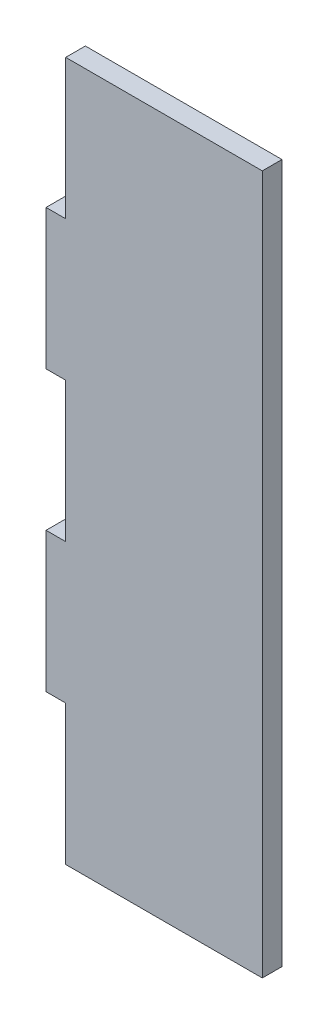
ISO-10303-21;
HEADER;
FILE_DESCRIPTION(('STEP AP214'),'2;1');
FILE_NAME('part.step','',(''),(''),'','','');
FILE_SCHEMA(('AUTOMOTIVE_DESIGN { 1 0 10303 214 1 1 1 1 }'));
ENDSEC;
DATA;
#1=APPLICATION_CONTEXT('core data for automotive mechanical design processes');
#2=APPLICATION_PROTOCOL_DEFINITION('international standard','automotive_design',2000,#1);
#3=PRODUCT_CONTEXT('',#1,'mechanical');
#4=PRODUCT('Part','Part','',(#3));
#5=PRODUCT_RELATED_PRODUCT_CATEGORY('part','',(#4));
#6=PRODUCT_DEFINITION_FORMATION('','',#4);
#7=PRODUCT_DEFINITION_CONTEXT('part definition',#1,'design');
#8=PRODUCT_DEFINITION('design','',#6,#7);
#9=PRODUCT_DEFINITION_SHAPE('','',#8);
#10=(LENGTH_UNIT() NAMED_UNIT(*) SI_UNIT(.MILLI.,.METRE.));
#11=(NAMED_UNIT(*) PLANE_ANGLE_UNIT() SI_UNIT($,.RADIAN.));
#12=(NAMED_UNIT(*) SI_UNIT($,.STERADIAN.) SOLID_ANGLE_UNIT());
#13=UNCERTAINTY_MEASURE_WITH_UNIT(LENGTH_MEASURE(1.E-05),#10,'distance_accuracy_value','');
#14=(GEOMETRIC_REPRESENTATION_CONTEXT(3) GLOBAL_UNCERTAINTY_ASSIGNED_CONTEXT((#13)) GLOBAL_UNIT_ASSIGNED_CONTEXT((#10,
#11,#12)) REPRESENTATION_CONTEXT('',''));
#15=CARTESIAN_POINT('',(0.,0.,0.));
#16=DIRECTION('',(0.,0.,1.));
#17=DIRECTION('',(1.,0.,0.));
#18=AXIS2_PLACEMENT_3D('',#15,#16,#17);
#19=CARTESIAN_POINT('',(0.,0.,9.));
#20=DIRECTION('',(1.,0.,0.));
#21=DIRECTION('',(0.,1.,0.));
#22=AXIS2_PLACEMENT_3D('',#19,#20,#21);
#23=PLANE('',#22);
#24=DIRECTION('',(0.,-1.,0.));
#25=VECTOR('',#24,1.);
#26=CARTESIAN_POINT('',(0.,0.,0.));
#27=LINE('',#26,#25);
#28=CARTESIAN_POINT('',(0.,64.,0.));
#29=VERTEX_POINT('',#28);
#30=CARTESIAN_POINT('',(0.,0.,0.));
#31=VERTEX_POINT('',#30);
#32=EDGE_CURVE('E165',#29,#31,#27,.T.);
#33=ORIENTED_EDGE('',*,*,#32,.T.);
#34=DIRECTION('',(0.,0.,-1.));
#35=VECTOR('',#34,1.);
#36=CARTESIAN_POINT('',(0.,0.,9.));
#37=LINE('',#36,#35);
#38=CARTESIAN_POINT('',(0.,0.,9.));
#39=VERTEX_POINT('',#38);
#40=EDGE_CURVE('E11',#39,#31,#37,.T.);
#41=ORIENTED_EDGE('',*,*,#40,.F.);
#42=DIRECTION('',(0.,-1.,0.));
#43=VECTOR('',#42,1.);
#44=CARTESIAN_POINT('',(0.,0.,9.));
#45=LINE('',#44,#43);
#46=CARTESIAN_POINT('',(0.,64.,9.));
#47=VERTEX_POINT('',#46);
#48=EDGE_CURVE('E187',#47,#39,#45,.T.);
#49=ORIENTED_EDGE('',*,*,#48,.F.);
#50=DIRECTION('',(0.,0.,-1.));
#51=VECTOR('',#50,1.);
#52=CARTESIAN_POINT('',(0.,64.,9.));
#53=LINE('',#52,#51);
#54=EDGE_CURVE('E161',#47,#29,#53,.T.);
#55=ORIENTED_EDGE('',*,*,#54,.T.);
#56=EDGE_LOOP('',(#33,#41,#49,#55));
#57=FACE_BOUND('',#56,.T.);
#58=ADVANCED_FACE('F45',(#57),#23,.F.);
#59=CARTESIAN_POINT('',(0.,0.,9.));
#60=DIRECTION('',(0.,1.,0.));
#61=DIRECTION('',(0.,0.,1.));
#62=AXIS2_PLACEMENT_3D('',#59,#60,#61);
#63=PLANE('',#62);
#64=DIRECTION('',(1.,0.,0.));
#65=VECTOR('',#64,1.);
#66=CARTESIAN_POINT('',(0.,0.,0.));
#67=LINE('',#66,#65);
#68=CARTESIAN_POINT('',(90.,0.,0.));
#69=VERTEX_POINT('',#68);
#70=EDGE_CURVE('E168',#31,#69,#67,.T.);
#71=ORIENTED_EDGE('',*,*,#70,.T.);
#72=DIRECTION('',(0.,0.,-1.));
#73=VECTOR('',#72,1.);
#74=CARTESIAN_POINT('',(90.,0.,9.));
#75=LINE('',#74,#73);
#76=CARTESIAN_POINT('',(90.,0.,9.));
#77=VERTEX_POINT('',#76);
#78=EDGE_CURVE('E53',#77,#69,#75,.T.);
#79=ORIENTED_EDGE('',*,*,#78,.F.);
#80=DIRECTION('',(1.,0.,0.));
#81=VECTOR('',#80,1.);
#82=CARTESIAN_POINT('',(0.,0.,9.));
#83=LINE('',#82,#81);
#84=EDGE_CURVE('E116',#39,#77,#83,.T.);
#85=ORIENTED_EDGE('',*,*,#84,.F.);
#86=ORIENTED_EDGE('',*,*,#40,.T.);
#87=EDGE_LOOP('',(#71,#79,#85,#86));
#88=FACE_BOUND('',#87,.T.);
#89=ADVANCED_FACE('F266',(#88),#63,.F.);
#90=CARTESIAN_POINT('',(90.,0.,9.));
#91=DIRECTION('',(-1.,0.,0.));
#92=DIRECTION('',(0.,-1.,0.));
#93=AXIS2_PLACEMENT_3D('',#90,#91,#92);
#94=PLANE('',#93);
#95=DIRECTION('',(0.,1.,0.));
#96=VECTOR('',#95,1.);
#97=CARTESIAN_POINT('',(90.,0.,0.));
#98=LINE('',#97,#96);
#99=CARTESIAN_POINT('',(89.9999999999999,320.,0.));
#100=VERTEX_POINT('',#99);
#101=EDGE_CURVE('E170',#69,#100,#98,.T.);
#102=ORIENTED_EDGE('',*,*,#101,.T.);
#103=DIRECTION('',(0.,0.,-1.));
#104=VECTOR('',#103,1.);
#105=CARTESIAN_POINT('',(89.9999999999999,320.,9.));
#106=LINE('',#105,#104);
#107=CARTESIAN_POINT('',(89.9999999999999,320.,9.));
#108=VERTEX_POINT('',#107);
#109=EDGE_CURVE('E206',#108,#100,#106,.T.);
#110=ORIENTED_EDGE('',*,*,#109,.F.);
#111=DIRECTION('',(0.,1.,0.));
#112=VECTOR('',#111,1.);
#113=CARTESIAN_POINT('',(90.,0.,9.));
#114=LINE('',#113,#112);
#115=EDGE_CURVE('E214',#77,#108,#114,.T.);
#116=ORIENTED_EDGE('',*,*,#115,.F.);
#117=ORIENTED_EDGE('',*,*,#78,.T.);
#118=EDGE_LOOP('',(#102,#110,#116,#117));
#119=FACE_BOUND('',#118,.T.);
#120=ADVANCED_FACE('F212',(#119),#94,.F.);
#121=CARTESIAN_POINT('',(0.,320.,9.));
#122=DIRECTION('',(0.,-1.,0.));
#123=DIRECTION('',(0.,0.,-1.));
#124=AXIS2_PLACEMENT_3D('',#121,#122,#123);
#125=PLANE('',#124);
#126=DIRECTION('',(-1.,0.,0.));
#127=VECTOR('',#126,1.);
#128=CARTESIAN_POINT('',(0.,320.,0.));
#129=LINE('',#128,#127);
#130=CARTESIAN_POINT('',(0.,320.,0.));
#131=VERTEX_POINT('',#130);
#132=EDGE_CURVE('E172',#100,#131,#129,.T.);
#133=ORIENTED_EDGE('',*,*,#132,.T.);
#134=DIRECTION('',(0.,0.,-1.));
#135=VECTOR('',#134,1.);
#136=CARTESIAN_POINT('',(0.,320.,9.));
#137=LINE('',#136,#135);
#138=CARTESIAN_POINT('',(0.,320.,9.));
#139=VERTEX_POINT('',#138);
#140=EDGE_CURVE('E203',#139,#131,#137,.T.);
#141=ORIENTED_EDGE('',*,*,#140,.F.);
#142=DIRECTION('',(-1.,0.,0.));
#143=VECTOR('',#142,1.);
#144=CARTESIAN_POINT('',(0.,320.,9.));
#145=LINE('',#144,#143);
#146=EDGE_CURVE('E232',#108,#139,#145,.T.);
#147=ORIENTED_EDGE('',*,*,#146,.F.);
#148=ORIENTED_EDGE('',*,*,#109,.T.);
#149=EDGE_LOOP('',(#133,#141,#147,#148));
#150=FACE_BOUND('',#149,.T.);
#151=ADVANCED_FACE('F223',(#150),#125,.F.);
#152=CARTESIAN_POINT('',(0.,256.,9.));
#153=DIRECTION('',(1.,0.,0.));
#154=DIRECTION('',(0.,1.,0.));
#155=AXIS2_PLACEMENT_3D('',#152,#153,#154);
#156=PLANE('',#155);
#157=DIRECTION('',(0.,-1.,0.));
#158=VECTOR('',#157,1.);
#159=CARTESIAN_POINT('',(0.,256.,0.));
#160=LINE('',#159,#158);
#161=CARTESIAN_POINT('',(0.,256.,0.));
#162=VERTEX_POINT('',#161);
#163=EDGE_CURVE('E174',#131,#162,#160,.T.);
#164=ORIENTED_EDGE('',*,*,#163,.T.);
#165=DIRECTION('',(0.,0.,-1.));
#166=VECTOR('',#165,1.);
#167=CARTESIAN_POINT('',(0.,256.,9.));
#168=LINE('',#167,#166);
#169=CARTESIAN_POINT('',(0.,256.,9.));
#170=VERTEX_POINT('',#169);
#171=EDGE_CURVE('E200',#170,#162,#168,.T.);
#172=ORIENTED_EDGE('',*,*,#171,.F.);
#173=DIRECTION('',(0.,-1.,0.));
#174=VECTOR('',#173,1.);
#175=CARTESIAN_POINT('',(0.,256.,9.));
#176=LINE('',#175,#174);
#177=EDGE_CURVE('E229',#139,#170,#176,.T.);
#178=ORIENTED_EDGE('',*,*,#177,.F.);
#179=ORIENTED_EDGE('',*,*,#140,.T.);
#180=EDGE_LOOP('',(#164,#172,#178,#179));
#181=FACE_BOUND('',#180,.T.);
#182=ADVANCED_FACE('F227',(#181),#156,.F.);
#183=CARTESIAN_POINT('',(0.,256.,9.));
#184=DIRECTION('',(0.,-1.,0.));
#185=DIRECTION('',(0.,0.,-1.));
#186=AXIS2_PLACEMENT_3D('',#183,#184,#185);
#187=PLANE('',#186);
#188=DIRECTION('',(-1.,0.,0.));
#189=VECTOR('',#188,1.);
#190=CARTESIAN_POINT('',(0.,256.,0.));
#191=LINE('',#190,#189);
#192=CARTESIAN_POINT('',(-9.,256.,0.));
#193=VERTEX_POINT('',#192);
#194=EDGE_CURVE('E176',#162,#193,#191,.T.);
#195=ORIENTED_EDGE('',*,*,#194,.T.);
#196=DIRECTION('',(0.,0.,-1.));
#197=VECTOR('',#196,1.);
#198=CARTESIAN_POINT('',(-9.,256.,9.));
#199=LINE('',#198,#197);
#200=CARTESIAN_POINT('',(-9.,256.,9.));
#201=VERTEX_POINT('',#200);
#202=EDGE_CURVE('E197',#201,#193,#199,.T.);
#203=ORIENTED_EDGE('',*,*,#202,.F.);
#204=DIRECTION('',(-1.,0.,0.));
#205=VECTOR('',#204,1.);
#206=CARTESIAN_POINT('',(0.,256.,9.));
#207=LINE('',#206,#205);
#208=EDGE_CURVE('E231',#170,#201,#207,.T.);
#209=ORIENTED_EDGE('',*,*,#208,.F.);
#210=ORIENTED_EDGE('',*,*,#171,.T.);
#211=EDGE_LOOP('',(#195,#203,#209,#210));
#212=FACE_BOUND('',#211,.T.);
#213=ADVANCED_FACE('F281',(#212),#187,.F.);
#214=CARTESIAN_POINT('',(-9.,256.,9.));
#215=DIRECTION('',(1.,0.,0.));
#216=DIRECTION('',(0.,1.,0.));
#217=AXIS2_PLACEMENT_3D('',#214,#215,#216);
#218=PLANE('',#217);
#219=DIRECTION('',(0.,-1.,0.));
#220=VECTOR('',#219,1.);
#221=CARTESIAN_POINT('',(-9.,256.,0.));
#222=LINE('',#221,#220);
#223=CARTESIAN_POINT('',(-8.99999999999999,192.,0.));
#224=VERTEX_POINT('',#223);
#225=EDGE_CURVE('E178',#193,#224,#222,.T.);
#226=ORIENTED_EDGE('',*,*,#225,.T.);
#227=DIRECTION('',(0.,0.,-1.));
#228=VECTOR('',#227,1.);
#229=CARTESIAN_POINT('',(-8.99999999999999,192.,9.));
#230=LINE('',#229,#228);
#231=CARTESIAN_POINT('',(-8.99999999999999,192.,9.));
#232=VERTEX_POINT('',#231);
#233=EDGE_CURVE('E194',#232,#224,#230,.T.);
#234=ORIENTED_EDGE('',*,*,#233,.F.);
#235=DIRECTION('',(0.,-1.,0.));
#236=VECTOR('',#235,1.);
#237=CARTESIAN_POINT('',(-9.,256.,9.));
#238=LINE('',#237,#236);
#239=EDGE_CURVE('E234',#201,#232,#238,.T.);
#240=ORIENTED_EDGE('',*,*,#239,.F.);
#241=ORIENTED_EDGE('',*,*,#202,.T.);
#242=EDGE_LOOP('',(#226,#234,#240,#241));
#243=FACE_BOUND('',#242,.T.);
#244=ADVANCED_FACE('F284',(#243),#218,.F.);
#245=CARTESIAN_POINT('',(0.,192.,9.));
#246=DIRECTION('',(0.,1.,0.));
#247=DIRECTION('',(0.,0.,1.));
#248=AXIS2_PLACEMENT_3D('',#245,#246,#247);
#249=PLANE('',#248);
#250=DIRECTION('',(1.,0.,0.));
#251=VECTOR('',#250,1.);
#252=CARTESIAN_POINT('',(0.,192.,0.));
#253=LINE('',#252,#251);
#254=CARTESIAN_POINT('',(0.,192.,0.));
#255=VERTEX_POINT('',#254);
#256=EDGE_CURVE('E180',#224,#255,#253,.T.);
#257=ORIENTED_EDGE('',*,*,#256,.T.);
#258=DIRECTION('',(0.,0.,-1.));
#259=VECTOR('',#258,1.);
#260=CARTESIAN_POINT('',(0.,192.,9.));
#261=LINE('',#260,#259);
#262=CARTESIAN_POINT('',(0.,192.,9.));
#263=VERTEX_POINT('',#262);
#264=EDGE_CURVE('E191',#263,#255,#261,.T.);
#265=ORIENTED_EDGE('',*,*,#264,.F.);
#266=DIRECTION('',(1.,0.,0.));
#267=VECTOR('',#266,1.);
#268=CARTESIAN_POINT('',(0.,192.,9.));
#269=LINE('',#268,#267);
#270=EDGE_CURVE('E240',#232,#263,#269,.T.);
#271=ORIENTED_EDGE('',*,*,#270,.F.);
#272=ORIENTED_EDGE('',*,*,#233,.T.);
#273=EDGE_LOOP('',(#257,#265,#271,#272));
#274=FACE_BOUND('',#273,.T.);
#275=ADVANCED_FACE('F246',(#274),#249,.F.);
#276=CARTESIAN_POINT('',(0.,128.,9.));
#277=DIRECTION('',(1.,0.,0.));
#278=DIRECTION('',(0.,1.,0.));
#279=AXIS2_PLACEMENT_3D('',#276,#277,#278);
#280=PLANE('',#279);
#281=DIRECTION('',(0.,-1.,0.));
#282=VECTOR('',#281,1.);
#283=CARTESIAN_POINT('',(0.,128.,0.));
#284=LINE('',#283,#282);
#285=CARTESIAN_POINT('',(0.,128.,0.));
#286=VERTEX_POINT('',#285);
#287=EDGE_CURVE('E182',#255,#286,#284,.T.);
#288=ORIENTED_EDGE('',*,*,#287,.T.);
#289=DIRECTION('',(0.,0.,-1.));
#290=VECTOR('',#289,1.);
#291=CARTESIAN_POINT('',(0.,128.,9.));
#292=LINE('',#291,#290);
#293=CARTESIAN_POINT('',(0.,128.,9.));
#294=VERTEX_POINT('',#293);
#295=EDGE_CURVE('E156',#294,#286,#292,.T.);
#296=ORIENTED_EDGE('',*,*,#295,.F.);
#297=DIRECTION('',(0.,-1.,0.));
#298=VECTOR('',#297,1.);
#299=CARTESIAN_POINT('',(0.,128.,9.));
#300=LINE('',#299,#298);
#301=EDGE_CURVE('E147',#263,#294,#300,.T.);
#302=ORIENTED_EDGE('',*,*,#301,.F.);
#303=ORIENTED_EDGE('',*,*,#264,.T.);
#304=EDGE_LOOP('',(#288,#296,#302,#303));
#305=FACE_BOUND('',#304,.T.);
#306=ADVANCED_FACE('F250',(#305),#280,.F.);
#307=CARTESIAN_POINT('',(0.,128.,9.));
#308=DIRECTION('',(0.,-1.,0.));
#309=DIRECTION('',(0.,0.,-1.));
#310=AXIS2_PLACEMENT_3D('',#307,#308,#309);
#311=PLANE('',#310);
#312=DIRECTION('',(-1.,0.,0.));
#313=VECTOR('',#312,1.);
#314=CARTESIAN_POINT('',(0.,128.,0.));
#315=LINE('',#314,#313);
#316=CARTESIAN_POINT('',(-9.,128.,0.));
#317=VERTEX_POINT('',#316);
#318=EDGE_CURVE('E155',#286,#317,#315,.T.);
#319=ORIENTED_EDGE('',*,*,#318,.T.);
#320=DIRECTION('',(0.,0.,-1.));
#321=VECTOR('',#320,1.);
#322=CARTESIAN_POINT('',(-9.,128.,9.));
#323=LINE('',#322,#321);
#324=CARTESIAN_POINT('',(-9.,128.,9.));
#325=VERTEX_POINT('',#324);
#326=EDGE_CURVE('E152',#325,#317,#323,.T.);
#327=ORIENTED_EDGE('',*,*,#326,.F.);
#328=DIRECTION('',(-1.,0.,0.));
#329=VECTOR('',#328,1.);
#330=CARTESIAN_POINT('',(0.,128.,9.));
#331=LINE('',#330,#329);
#332=EDGE_CURVE('E141',#294,#325,#331,.T.);
#333=ORIENTED_EDGE('',*,*,#332,.F.);
#334=ORIENTED_EDGE('',*,*,#295,.T.);
#335=EDGE_LOOP('',(#319,#327,#333,#334));
#336=FACE_BOUND('',#335,.T.);
#337=ADVANCED_FACE('F153',(#336),#311,.F.);
#338=CARTESIAN_POINT('',(-9.,128.,9.));
#339=DIRECTION('',(1.,0.,0.));
#340=DIRECTION('',(0.,1.,0.));
#341=AXIS2_PLACEMENT_3D('',#338,#339,#340);
#342=PLANE('',#341);
#343=DIRECTION('',(0.,-1.,0.));
#344=VECTOR('',#343,1.);
#345=CARTESIAN_POINT('',(-9.,128.,0.));
#346=LINE('',#345,#344);
#347=CARTESIAN_POINT('',(-8.99999999999999,64.,0.));
#348=VERTEX_POINT('',#347);
#349=EDGE_CURVE('E102',#317,#348,#346,.T.);
#350=ORIENTED_EDGE('',*,*,#349,.T.);
#351=DIRECTION('',(0.,0.,-1.));
#352=VECTOR('',#351,1.);
#353=CARTESIAN_POINT('',(-8.99999999999999,64.,9.));
#354=LINE('',#353,#352);
#355=CARTESIAN_POINT('',(-8.99999999999999,64.,9.));
#356=VERTEX_POINT('',#355);
#357=EDGE_CURVE('E157',#356,#348,#354,.T.);
#358=ORIENTED_EDGE('',*,*,#357,.F.);
#359=DIRECTION('',(0.,-1.,0.));
#360=VECTOR('',#359,1.);
#361=CARTESIAN_POINT('',(-9.,128.,9.));
#362=LINE('',#361,#360);
#363=EDGE_CURVE('E145',#325,#356,#362,.T.);
#364=ORIENTED_EDGE('',*,*,#363,.F.);
#365=ORIENTED_EDGE('',*,*,#326,.T.);
#366=EDGE_LOOP('',(#350,#358,#364,#365));
#367=FACE_BOUND('',#366,.T.);
#368=ADVANCED_FACE('F159',(#367),#342,.F.);
#369=CARTESIAN_POINT('',(0.,64.,9.));
#370=DIRECTION('',(0.,1.,0.));
#371=DIRECTION('',(0.,0.,1.));
#372=AXIS2_PLACEMENT_3D('',#369,#370,#371);
#373=PLANE('',#372);
#374=DIRECTION('',(1.,0.,0.));
#375=VECTOR('',#374,1.);
#376=CARTESIAN_POINT('',(0.,64.,0.));
#377=LINE('',#376,#375);
#378=EDGE_CURVE('E108',#348,#29,#377,.T.);
#379=ORIENTED_EDGE('',*,*,#378,.T.);
#380=ORIENTED_EDGE('',*,*,#54,.F.);
#381=DIRECTION('',(1.,0.,0.));
#382=VECTOR('',#381,1.);
#383=CARTESIAN_POINT('',(0.,64.,9.));
#384=LINE('',#383,#382);
#385=EDGE_CURVE('E61',#356,#47,#384,.T.);
#386=ORIENTED_EDGE('',*,*,#385,.F.);
#387=ORIENTED_EDGE('',*,*,#357,.T.);
#388=EDGE_LOOP('',(#379,#380,#386,#387));
#389=FACE_BOUND('',#388,.T.);
#390=ADVANCED_FACE('F254',(#389),#373,.F.);
#391=CARTESIAN_POINT('',(0.,0.,9.));
#392=DIRECTION('',(0.,0.,1.));
#393=DIRECTION('',(1.,0.,0.));
#394=AXIS2_PLACEMENT_3D('',#391,#392,#393);
#395=PLANE('',#394);
#396=ORIENTED_EDGE('',*,*,#48,.T.);
#397=ORIENTED_EDGE('',*,*,#84,.T.);
#398=ORIENTED_EDGE('',*,*,#115,.T.);
#399=ORIENTED_EDGE('',*,*,#146,.T.);
#400=ORIENTED_EDGE('',*,*,#177,.T.);
#401=ORIENTED_EDGE('',*,*,#208,.T.);
#402=ORIENTED_EDGE('',*,*,#239,.T.);
#403=ORIENTED_EDGE('',*,*,#270,.T.);
#404=ORIENTED_EDGE('',*,*,#301,.T.);
#405=ORIENTED_EDGE('',*,*,#332,.T.);
#406=ORIENTED_EDGE('',*,*,#363,.T.);
#407=ORIENTED_EDGE('',*,*,#385,.T.);
#408=EDGE_LOOP('',(#396,#397,#398,#399,#400,#401,#402,#403,#404,#405,#406,#407));
#409=FACE_BOUND('',#408,.T.);
#410=ADVANCED_FACE('F143',(#409),#395,.T.);
#411=CARTESIAN_POINT('',(0.,0.,0.));
#412=DIRECTION('',(0.,0.,1.));
#413=DIRECTION('',(1.,0.,0.));
#414=AXIS2_PLACEMENT_3D('',#411,#412,#413);
#415=PLANE('',#414);
#416=ORIENTED_EDGE('',*,*,#32,.F.);
#417=ORIENTED_EDGE('',*,*,#378,.F.);
#418=ORIENTED_EDGE('',*,*,#349,.F.);
#419=ORIENTED_EDGE('',*,*,#318,.F.);
#420=ORIENTED_EDGE('',*,*,#287,.F.);
#421=ORIENTED_EDGE('',*,*,#256,.F.);
#422=ORIENTED_EDGE('',*,*,#225,.F.);
#423=ORIENTED_EDGE('',*,*,#194,.F.);
#424=ORIENTED_EDGE('',*,*,#163,.F.);
#425=ORIENTED_EDGE('',*,*,#132,.F.);
#426=ORIENTED_EDGE('',*,*,#101,.F.);
#427=ORIENTED_EDGE('',*,*,#70,.F.);
#428=EDGE_LOOP('',(#416,#417,#418,#419,#420,#421,#422,#423,#424,#425,#426,#427));
#429=FACE_BOUND('',#428,.T.);
#430=ADVANCED_FACE('F218',(#429),#415,.F.);
#431=CLOSED_SHELL('',(#58,#89,#120,#151,#182,#213,#244,#275,#306,#337,#368,#390,#410,#430));
#432=MANIFOLD_SOLID_BREP('B2',#431);
#433=ADVANCED_BREP_SHAPE_REPRESENTATION('',(#18,#432),#14);
#434=SHAPE_DEFINITION_REPRESENTATION(#9,#433);
ENDSEC;
END-ISO-10303-21;
